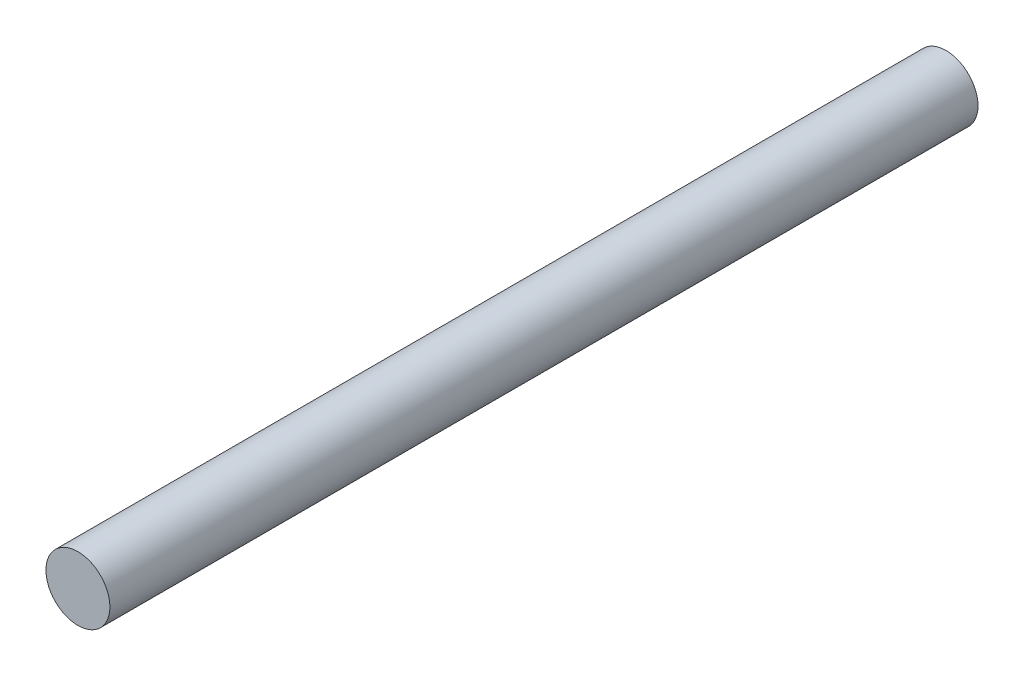
ISO-10303-21;
HEADER;
FILE_DESCRIPTION(('STEP AP214'),'2;1');
FILE_NAME('part.step','',(''),(''),'','','');
FILE_SCHEMA(('AUTOMOTIVE_DESIGN { 1 0 10303 214 1 1 1 1 }'));
ENDSEC;
DATA;
#1=APPLICATION_CONTEXT('core data for automotive mechanical design processes');
#2=APPLICATION_PROTOCOL_DEFINITION('international standard','automotive_design',2000,#1);
#3=PRODUCT_CONTEXT('',#1,'mechanical');
#4=PRODUCT('Part','Part','',(#3));
#5=PRODUCT_RELATED_PRODUCT_CATEGORY('part','',(#4));
#6=PRODUCT_DEFINITION_FORMATION('','',#4);
#7=PRODUCT_DEFINITION_CONTEXT('part definition',#1,'design');
#8=PRODUCT_DEFINITION('design','',#6,#7);
#9=PRODUCT_DEFINITION_SHAPE('','',#8);
#10=(LENGTH_UNIT() NAMED_UNIT(*) SI_UNIT(.MILLI.,.METRE.));
#11=(NAMED_UNIT(*) PLANE_ANGLE_UNIT() SI_UNIT($,.RADIAN.));
#12=(NAMED_UNIT(*) SI_UNIT($,.STERADIAN.) SOLID_ANGLE_UNIT());
#13=UNCERTAINTY_MEASURE_WITH_UNIT(LENGTH_MEASURE(1.E-05),#10,'distance_accuracy_value','');
#14=(GEOMETRIC_REPRESENTATION_CONTEXT(3) GLOBAL_UNCERTAINTY_ASSIGNED_CONTEXT((#13)) GLOBAL_UNIT_ASSIGNED_CONTEXT((#10,
#11,#12)) REPRESENTATION_CONTEXT('',''));
#15=CARTESIAN_POINT('',(0.,0.,0.));
#16=DIRECTION('',(0.,0.,1.));
#17=DIRECTION('',(1.,0.,0.));
#18=AXIS2_PLACEMENT_3D('',#15,#16,#17);
#19=CARTESIAN_POINT('',(0.,0.,95.));
#20=DIRECTION('',(0.,0.,-1.));
#21=DIRECTION('',(-1.,0.,0.));
#22=AXIS2_PLACEMENT_3D('',#19,#20,#21);
#23=CYLINDRICAL_SURFACE('',#22,3.5);
#24=CARTESIAN_POINT('',(0.,0.,95.));
#25=DIRECTION('',(0.,0.,1.));
#26=DIRECTION('',(1.,0.,0.));
#27=AXIS2_PLACEMENT_3D('',#24,#25,#26);
#28=CIRCLE('',#27,3.5);
#29=CARTESIAN_POINT('',(3.5,0.,95.));
#30=VERTEX_POINT('',#29);
#31=EDGE_CURVE('E10',#30,#30,#28,.T.);
#32=ORIENTED_EDGE('',*,*,#31,.F.);
#33=EDGE_LOOP('',(#32));
#34=FACE_BOUND('',#33,.T.);
#35=CARTESIAN_POINT('',(0.,0.,0.));
#36=DIRECTION('',(0.,0.,1.));
#37=DIRECTION('',(1.,0.,0.));
#38=AXIS2_PLACEMENT_3D('',#35,#36,#37);
#39=CIRCLE('',#38,3.5);
#40=CARTESIAN_POINT('',(3.5,0.,0.));
#41=VERTEX_POINT('',#40);
#42=EDGE_CURVE('E41',#41,#41,#39,.T.);
#43=ORIENTED_EDGE('',*,*,#42,.T.);
#44=EDGE_LOOP('',(#43));
#45=FACE_BOUND('',#44,.T.);
#46=ADVANCED_FACE('F38',(#34,#45),#23,.T.);
#47=CARTESIAN_POINT('',(0.,0.,95.));
#48=DIRECTION('',(0.,0.,1.));
#49=DIRECTION('',(1.,0.,0.));
#50=AXIS2_PLACEMENT_3D('',#47,#48,#49);
#51=PLANE('',#50);
#52=ORIENTED_EDGE('',*,*,#31,.T.);
#53=EDGE_LOOP('',(#52));
#54=FACE_BOUND('',#53,.T.);
#55=ADVANCED_FACE('F53',(#54),#51,.T.);
#56=CARTESIAN_POINT('',(0.,0.,0.));
#57=DIRECTION('',(0.,0.,1.));
#58=DIRECTION('',(1.,0.,0.));
#59=AXIS2_PLACEMENT_3D('',#56,#57,#58);
#60=PLANE('',#59);
#61=ORIENTED_EDGE('',*,*,#42,.F.);
#62=EDGE_LOOP('',(#61));
#63=FACE_BOUND('',#62,.T.);
#64=ADVANCED_FACE('F51',(#63),#60,.F.);
#65=CLOSED_SHELL('',(#46,#55,#64));
#66=MANIFOLD_SOLID_BREP('B2',#65);
#67=ADVANCED_BREP_SHAPE_REPRESENTATION('',(#18,#66),#14);
#68=SHAPE_DEFINITION_REPRESENTATION(#9,#67);
ENDSEC;
END-ISO-10303-21;
